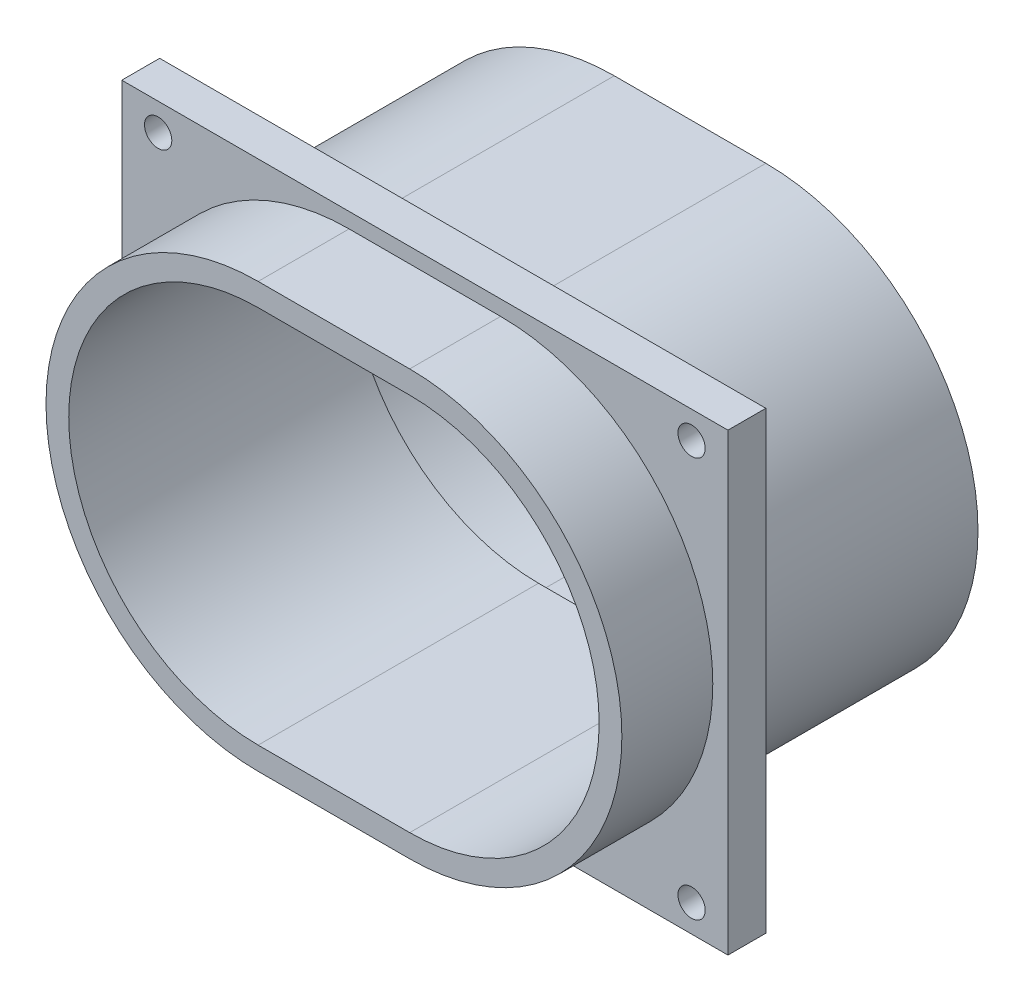
ISO-10303-21;
HEADER;
FILE_DESCRIPTION(('STEP AP214'),'2;1');
FILE_NAME('part.step','',(''),(''),'','','');
FILE_SCHEMA(('AUTOMOTIVE_DESIGN { 1 0 10303 214 1 1 1 1 }'));
ENDSEC;
DATA;
#1=APPLICATION_CONTEXT('core data for automotive mechanical design processes');
#2=APPLICATION_PROTOCOL_DEFINITION('international standard','automotive_design',2000,#1);
#3=PRODUCT_CONTEXT('',#1,'mechanical');
#4=PRODUCT('Part','Part','',(#3));
#5=PRODUCT_RELATED_PRODUCT_CATEGORY('part','',(#4));
#6=PRODUCT_DEFINITION_FORMATION('','',#4);
#7=PRODUCT_DEFINITION_CONTEXT('part definition',#1,'design');
#8=PRODUCT_DEFINITION('design','',#6,#7);
#9=PRODUCT_DEFINITION_SHAPE('','',#8);
#10=(LENGTH_UNIT() NAMED_UNIT(*) SI_UNIT(.MILLI.,.METRE.));
#11=(NAMED_UNIT(*) PLANE_ANGLE_UNIT() SI_UNIT($,.RADIAN.));
#12=(NAMED_UNIT(*) SI_UNIT($,.STERADIAN.) SOLID_ANGLE_UNIT());
#13=UNCERTAINTY_MEASURE_WITH_UNIT(LENGTH_MEASURE(1.E-05),#10,'distance_accuracy_value','');
#14=(GEOMETRIC_REPRESENTATION_CONTEXT(3) GLOBAL_UNCERTAINTY_ASSIGNED_CONTEXT((#13)) GLOBAL_UNIT_ASSIGNED_CONTEXT((#10,
#11,#12)) REPRESENTATION_CONTEXT('',''));
#15=CARTESIAN_POINT('',(0.,0.,0.));
#16=DIRECTION('',(0.,0.,1.));
#17=DIRECTION('',(1.,0.,0.));
#18=AXIS2_PLACEMENT_3D('',#15,#16,#17);
#19=CARTESIAN_POINT('',(-10.,0.,0.));
#20=DIRECTION('',(0.,0.,1.));
#21=DIRECTION('',(1.,0.,0.));
#22=AXIS2_PLACEMENT_3D('',#19,#20,#21);
#23=CYLINDRICAL_SURFACE('',#22,25.);
#24=CARTESIAN_POINT('',(-10.,0.,-25.));
#25=DIRECTION('',(0.,0.,-1.));
#26=DIRECTION('',(-1.,0.,0.));
#27=AXIS2_PLACEMENT_3D('',#24,#25,#26);
#28=CIRCLE('',#27,25.);
#29=CARTESIAN_POINT('',(-10.0000000000001,25.,-25.));
#30=VERTEX_POINT('',#29);
#31=CARTESIAN_POINT('',(-10.,-25.,-25.));
#32=VERTEX_POINT('',#31);
#33=EDGE_CURVE('E47',#30,#32,#28,.F.);
#34=ORIENTED_EDGE('',*,*,#33,.F.);
#35=DIRECTION('',(0.,0.,1.));
#36=VECTOR('',#35,1.);
#37=CARTESIAN_POINT('',(-10.,25.,0.));
#38=LINE('',#37,#36);
#39=CARTESIAN_POINT('',(-10.,25.,12.));
#40=VERTEX_POINT('',#39);
#41=EDGE_CURVE('E298',#30,#40,#38,.T.);
#42=ORIENTED_EDGE('',*,*,#41,.T.);
#43=CARTESIAN_POINT('',(-10.,0.,12.));
#44=DIRECTION('',(0.,0.,1.));
#45=DIRECTION('',(1.,0.,0.));
#46=AXIS2_PLACEMENT_3D('',#43,#44,#45);
#47=CIRCLE('',#46,25.);
#48=CARTESIAN_POINT('',(-10.,-25.,12.));
#49=VERTEX_POINT('',#48);
#50=EDGE_CURVE('E285',#40,#49,#47,.T.);
#51=ORIENTED_EDGE('',*,*,#50,.T.);
#52=DIRECTION('',(0.,0.,1.));
#53=VECTOR('',#52,1.);
#54=CARTESIAN_POINT('',(-10.,-25.,0.));
#55=LINE('',#54,#53);
#56=EDGE_CURVE('E297',#32,#49,#55,.T.);
#57=ORIENTED_EDGE('',*,*,#56,.F.);
#58=EDGE_LOOP('',(#34,#42,#51,#57));
#59=FACE_BOUND('',#58,.T.);
#60=ADVANCED_FACE('F33',(#59),#23,.F.);
#61=CARTESIAN_POINT('',(10.,25.,0.));
#62=DIRECTION('',(0.,1.,0.));
#63=DIRECTION('',(0.,0.,1.));
#64=AXIS2_PLACEMENT_3D('',#61,#62,#63);
#65=PLANE('',#64);
#66=DIRECTION('',(-1.,0.,0.));
#67=VECTOR('',#66,1.);
#68=CARTESIAN_POINT('',(10.,25.,-25.));
#69=LINE('',#68,#67);
#70=CARTESIAN_POINT('',(10.,25.,-25.));
#71=VERTEX_POINT('',#70);
#72=EDGE_CURVE('E209',#71,#30,#69,.T.);
#73=ORIENTED_EDGE('',*,*,#72,.F.);
#74=DIRECTION('',(0.,0.,1.));
#75=VECTOR('',#74,1.);
#76=CARTESIAN_POINT('',(10.,25.,0.));
#77=LINE('',#76,#75);
#78=CARTESIAN_POINT('',(10.,25.,12.));
#79=VERTEX_POINT('',#78);
#80=EDGE_CURVE('E301',#71,#79,#77,.T.);
#81=ORIENTED_EDGE('',*,*,#80,.T.);
#82=DIRECTION('',(-1.,0.,0.));
#83=VECTOR('',#82,1.);
#84=CARTESIAN_POINT('',(10.,25.,12.));
#85=LINE('',#84,#83);
#86=EDGE_CURVE('E294',#79,#40,#85,.T.);
#87=ORIENTED_EDGE('',*,*,#86,.T.);
#88=ORIENTED_EDGE('',*,*,#41,.F.);
#89=EDGE_LOOP('',(#73,#81,#87,#88));
#90=FACE_BOUND('',#89,.T.);
#91=ADVANCED_FACE('F365',(#90),#65,.F.);
#92=CARTESIAN_POINT('',(10.,0.,0.));
#93=DIRECTION('',(0.,0.,1.));
#94=DIRECTION('',(1.,0.,0.));
#95=AXIS2_PLACEMENT_3D('',#92,#93,#94);
#96=CYLINDRICAL_SURFACE('',#95,25.);
#97=CARTESIAN_POINT('',(10.,0.,-25.));
#98=DIRECTION('',(0.,0.,-1.));
#99=DIRECTION('',(-1.,0.,0.));
#100=AXIS2_PLACEMENT_3D('',#97,#98,#99);
#101=CIRCLE('',#100,25.);
#102=CARTESIAN_POINT('',(10.0000000000001,-25.,-25.));
#103=VERTEX_POINT('',#102);
#104=EDGE_CURVE('E204',#103,#71,#101,.F.);
#105=ORIENTED_EDGE('',*,*,#104,.F.);
#106=DIRECTION('',(0.,0.,1.));
#107=VECTOR('',#106,1.);
#108=CARTESIAN_POINT('',(9.99999999999999,-25.,0.));
#109=LINE('',#108,#107);
#110=CARTESIAN_POINT('',(9.99999999999999,-25.,12.));
#111=VERTEX_POINT('',#110);
#112=EDGE_CURVE('E303',#103,#111,#109,.T.);
#113=ORIENTED_EDGE('',*,*,#112,.T.);
#114=CARTESIAN_POINT('',(10.,0.,12.));
#115=DIRECTION('',(0.,0.,1.));
#116=DIRECTION('',(1.,0.,0.));
#117=AXIS2_PLACEMENT_3D('',#114,#115,#116);
#118=CIRCLE('',#117,25.);
#119=EDGE_CURVE('E291',#111,#79,#118,.T.);
#120=ORIENTED_EDGE('',*,*,#119,.T.);
#121=ORIENTED_EDGE('',*,*,#80,.F.);
#122=EDGE_LOOP('',(#105,#113,#120,#121));
#123=FACE_BOUND('',#122,.T.);
#124=ADVANCED_FACE('F371',(#123),#96,.F.);
#125=CARTESIAN_POINT('',(10.,-25.,0.));
#126=DIRECTION('',(0.,-1.,0.));
#127=DIRECTION('',(0.,0.,-1.));
#128=AXIS2_PLACEMENT_3D('',#125,#126,#127);
#129=PLANE('',#128);
#130=DIRECTION('',(1.,0.,0.));
#131=VECTOR('',#130,1.);
#132=CARTESIAN_POINT('',(10.,-25.,-25.));
#133=LINE('',#132,#131);
#134=EDGE_CURVE('E11',#32,#103,#133,.T.);
#135=ORIENTED_EDGE('',*,*,#134,.F.);
#136=ORIENTED_EDGE('',*,*,#56,.T.);
#137=DIRECTION('',(1.,0.,0.));
#138=VECTOR('',#137,1.);
#139=CARTESIAN_POINT('',(10.,-25.,12.));
#140=LINE('',#139,#138);
#141=EDGE_CURVE('E288',#49,#111,#140,.T.);
#142=ORIENTED_EDGE('',*,*,#141,.T.);
#143=ORIENTED_EDGE('',*,*,#112,.F.);
#144=EDGE_LOOP('',(#135,#136,#142,#143));
#145=FACE_BOUND('',#144,.T.);
#146=ADVANCED_FACE('F376',(#145),#129,.F.);
#147=CARTESIAN_POINT('',(0.,0.,-5.));
#148=DIRECTION('',(0.,0.,-1.));
#149=DIRECTION('',(-1.,0.,0.));
#150=AXIS2_PLACEMENT_3D('',#147,#148,#149);
#151=PLANE('',#150);
#152=CARTESIAN_POINT('',(35.2,-26.4,-5.));
#153=DIRECTION('',(0.,0.,-1.));
#154=DIRECTION('',(-1.,0.,0.));
#155=AXIS2_PLACEMENT_3D('',#152,#153,#154);
#156=CIRCLE('',#155,1.8);
#157=CARTESIAN_POINT('',(33.4,-26.4,-5.));
#158=VERTEX_POINT('',#157);
#159=EDGE_CURVE('E212',#158,#158,#156,.T.);
#160=ORIENTED_EDGE('',*,*,#159,.F.);
#161=EDGE_LOOP('',(#160));
#162=FACE_BOUND('',#161,.T.);
#163=CARTESIAN_POINT('',(-35.2,-26.4,-5.));
#164=DIRECTION('',(0.,0.,-1.));
#165=DIRECTION('',(-1.,0.,0.));
#166=AXIS2_PLACEMENT_3D('',#163,#164,#165);
#167=CIRCLE('',#166,1.8);
#168=CARTESIAN_POINT('',(-37.,-26.4,-5.));
#169=VERTEX_POINT('',#168);
#170=EDGE_CURVE('E217',#169,#169,#167,.T.);
#171=ORIENTED_EDGE('',*,*,#170,.F.);
#172=EDGE_LOOP('',(#171));
#173=FACE_BOUND('',#172,.T.);
#174=CARTESIAN_POINT('',(-35.2,26.4,-5.));
#175=DIRECTION('',(0.,0.,-1.));
#176=DIRECTION('',(-1.,0.,0.));
#177=AXIS2_PLACEMENT_3D('',#174,#175,#176);
#178=CIRCLE('',#177,1.8);
#179=CARTESIAN_POINT('',(-37.,26.4,-5.));
#180=VERTEX_POINT('',#179);
#181=EDGE_CURVE('E213',#180,#180,#178,.T.);
#182=ORIENTED_EDGE('',*,*,#181,.F.);
#183=EDGE_LOOP('',(#182));
#184=FACE_BOUND('',#183,.T.);
#185=CARTESIAN_POINT('',(35.2,26.4,-5.));
#186=DIRECTION('',(0.,0.,-1.));
#187=DIRECTION('',(-1.,0.,0.));
#188=AXIS2_PLACEMENT_3D('',#185,#186,#187);
#189=CIRCLE('',#188,1.8);
#190=CARTESIAN_POINT('',(33.4,26.4,-5.));
#191=VERTEX_POINT('',#190);
#192=EDGE_CURVE('E216',#191,#191,#189,.T.);
#193=ORIENTED_EDGE('',*,*,#192,.F.);
#194=EDGE_LOOP('',(#193));
#195=FACE_BOUND('',#194,.T.);
#196=DIRECTION('',(0.,-1.,0.));
#197=VECTOR('',#196,1.);
#198=CARTESIAN_POINT('',(40.,-30.,-5.));
#199=LINE('',#198,#197);
#200=CARTESIAN_POINT('',(40.,30.,-5.));
#201=VERTEX_POINT('',#200);
#202=CARTESIAN_POINT('',(40.,-30.,-5.));
#203=VERTEX_POINT('',#202);
#204=EDGE_CURVE('E256',#201,#203,#199,.T.);
#205=ORIENTED_EDGE('',*,*,#204,.T.);
#206=DIRECTION('',(-1.,0.,0.));
#207=VECTOR('',#206,1.);
#208=CARTESIAN_POINT('',(-40.,-30.,-5.));
#209=LINE('',#208,#207);
#210=CARTESIAN_POINT('',(-40.,-30.,-5.));
#211=VERTEX_POINT('',#210);
#212=EDGE_CURVE('E259',#203,#211,#209,.T.);
#213=ORIENTED_EDGE('',*,*,#212,.T.);
#214=DIRECTION('',(0.,1.,0.));
#215=VECTOR('',#214,1.);
#216=CARTESIAN_POINT('',(-40.,-30.,-5.));
#217=LINE('',#216,#215);
#218=CARTESIAN_POINT('',(-40.,30.,-5.));
#219=VERTEX_POINT('',#218);
#220=EDGE_CURVE('E262',#211,#219,#217,.T.);
#221=ORIENTED_EDGE('',*,*,#220,.T.);
#222=DIRECTION('',(1.,0.,0.));
#223=VECTOR('',#222,1.);
#224=CARTESIAN_POINT('',(-40.,30.,-5.));
#225=LINE('',#224,#223);
#226=EDGE_CURVE('E264',#219,#201,#225,.T.);
#227=ORIENTED_EDGE('',*,*,#226,.T.);
#228=EDGE_LOOP('',(#205,#213,#221,#227));
#229=FACE_BOUND('',#228,.T.);
#230=DIRECTION('',(-1.,0.,0.));
#231=VECTOR('',#230,1.);
#232=CARTESIAN_POINT('',(-10.,-28.,-5.));
#233=LINE('',#232,#231);
#234=CARTESIAN_POINT('',(10.,-28.,-5.));
#235=VERTEX_POINT('',#234);
#236=CARTESIAN_POINT('',(-10.,-28.,-5.));
#237=VERTEX_POINT('',#236);
#238=EDGE_CURVE('E239',#235,#237,#233,.T.);
#239=ORIENTED_EDGE('',*,*,#238,.F.);
#240=CARTESIAN_POINT('',(10.,0.,-5.));
#241=DIRECTION('',(0.,0.,-1.));
#242=DIRECTION('',(-1.,0.,0.));
#243=AXIS2_PLACEMENT_3D('',#240,#241,#242);
#244=CIRCLE('',#243,28.);
#245=CARTESIAN_POINT('',(10.,28.,-5.));
#246=VERTEX_POINT('',#245);
#247=EDGE_CURVE('E236',#246,#235,#244,.T.);
#248=ORIENTED_EDGE('',*,*,#247,.F.);
#249=DIRECTION('',(1.,0.,0.));
#250=VECTOR('',#249,1.);
#251=CARTESIAN_POINT('',(-10.,28.,-5.));
#252=LINE('',#251,#250);
#253=CARTESIAN_POINT('',(-10.,28.,-5.));
#254=VERTEX_POINT('',#253);
#255=EDGE_CURVE('E229',#254,#246,#252,.T.);
#256=ORIENTED_EDGE('',*,*,#255,.F.);
#257=CARTESIAN_POINT('',(-10.,0.,-5.));
#258=DIRECTION('',(0.,0.,-1.));
#259=DIRECTION('',(-1.,0.,0.));
#260=AXIS2_PLACEMENT_3D('',#257,#258,#259);
#261=CIRCLE('',#260,28.);
#262=EDGE_CURVE('E242',#237,#254,#261,.T.);
#263=ORIENTED_EDGE('',*,*,#262,.F.);
#264=EDGE_LOOP('',(#239,#248,#256,#263));
#265=FACE_BOUND('',#264,.T.);
#266=ADVANCED_FACE('F395',(#162,#173,#184,#195,#229,#265),#151,.T.);
#267=CARTESIAN_POINT('',(-10.,0.,12.));
#268=DIRECTION('',(0.,0.,-1.));
#269=DIRECTION('',(-1.,0.,0.));
#270=AXIS2_PLACEMENT_3D('',#267,#268,#269);
#271=CYLINDRICAL_SURFACE('',#270,28.);
#272=CARTESIAN_POINT('',(-10.,0.,0.));
#273=DIRECTION('',(0.,0.,1.));
#274=DIRECTION('',(1.,0.,0.));
#275=AXIS2_PLACEMENT_3D('',#272,#273,#274);
#276=CIRCLE('',#275,28.);
#277=CARTESIAN_POINT('',(-10.,28.,0.));
#278=VERTEX_POINT('',#277);
#279=CARTESIAN_POINT('',(-10.,-28.,0.));
#280=VERTEX_POINT('',#279);
#281=EDGE_CURVE('E300',#278,#280,#276,.T.);
#282=ORIENTED_EDGE('',*,*,#281,.T.);
#283=DIRECTION('',(0.,0.,-1.));
#284=VECTOR('',#283,1.);
#285=CARTESIAN_POINT('',(-10.,-28.,12.));
#286=LINE('',#285,#284);
#287=CARTESIAN_POINT('',(-10.,-28.,12.));
#288=VERTEX_POINT('',#287);
#289=EDGE_CURVE('E41',#288,#280,#286,.T.);
#290=ORIENTED_EDGE('',*,*,#289,.F.);
#291=CARTESIAN_POINT('',(-10.,0.,12.));
#292=DIRECTION('',(0.,0.,1.));
#293=DIRECTION('',(1.,0.,0.));
#294=AXIS2_PLACEMENT_3D('',#291,#292,#293);
#295=CIRCLE('',#294,28.);
#296=CARTESIAN_POINT('',(-10.,28.,12.));
#297=VERTEX_POINT('',#296);
#298=EDGE_CURVE('E306',#297,#288,#295,.T.);
#299=ORIENTED_EDGE('',*,*,#298,.F.);
#300=DIRECTION('',(0.,0.,-1.));
#301=VECTOR('',#300,1.);
#302=CARTESIAN_POINT('',(-10.,28.,12.));
#303=LINE('',#302,#301);
#304=EDGE_CURVE('E316',#297,#278,#303,.T.);
#305=ORIENTED_EDGE('',*,*,#304,.T.);
#306=EDGE_LOOP('',(#282,#290,#299,#305));
#307=FACE_BOUND('',#306,.T.);
#308=ADVANCED_FACE('F35',(#307),#271,.T.);
#309=CARTESIAN_POINT('',(10.,-28.,12.));
#310=DIRECTION('',(0.,1.,0.));
#311=DIRECTION('',(-1.,0.,0.));
#312=AXIS2_PLACEMENT_3D('',#309,#310,#311);
#313=PLANE('',#312);
#314=DIRECTION('',(1.,0.,0.));
#315=VECTOR('',#314,1.);
#316=CARTESIAN_POINT('',(10.,-28.,0.));
#317=LINE('',#316,#315);
#318=CARTESIAN_POINT('',(9.99999999999999,-28.,0.));
#319=VERTEX_POINT('',#318);
#320=EDGE_CURVE('E319',#280,#319,#317,.T.);
#321=ORIENTED_EDGE('',*,*,#320,.T.);
#322=DIRECTION('',(0.,0.,-1.));
#323=VECTOR('',#322,1.);
#324=CARTESIAN_POINT('',(9.99999999999999,-28.,12.));
#325=LINE('',#324,#323);
#326=CARTESIAN_POINT('',(9.99999999999999,-28.,12.));
#327=VERTEX_POINT('',#326);
#328=EDGE_CURVE('E332',#327,#319,#325,.T.);
#329=ORIENTED_EDGE('',*,*,#328,.F.);
#330=DIRECTION('',(1.,0.,0.));
#331=VECTOR('',#330,1.);
#332=CARTESIAN_POINT('',(10.,-28.,12.));
#333=LINE('',#332,#331);
#334=EDGE_CURVE('E309',#288,#327,#333,.T.);
#335=ORIENTED_EDGE('',*,*,#334,.F.);
#336=ORIENTED_EDGE('',*,*,#289,.T.);
#337=EDGE_LOOP('',(#321,#329,#335,#336));
#338=FACE_BOUND('',#337,.T.);
#339=ADVANCED_FACE('F388',(#338),#313,.F.);
#340=CARTESIAN_POINT('',(10.,0.,12.));
#341=DIRECTION('',(0.,0.,-1.));
#342=DIRECTION('',(-1.,0.,0.));
#343=AXIS2_PLACEMENT_3D('',#340,#341,#342);
#344=CYLINDRICAL_SURFACE('',#343,28.);
#345=CARTESIAN_POINT('',(10.,0.,0.));
#346=DIRECTION('',(0.,0.,1.));
#347=DIRECTION('',(1.,0.,0.));
#348=AXIS2_PLACEMENT_3D('',#345,#346,#347);
#349=CIRCLE('',#348,28.);
#350=CARTESIAN_POINT('',(10.,28.,0.));
#351=VERTEX_POINT('',#350);
#352=EDGE_CURVE('E322',#319,#351,#349,.T.);
#353=ORIENTED_EDGE('',*,*,#352,.T.);
#354=DIRECTION('',(0.,0.,-1.));
#355=VECTOR('',#354,1.);
#356=CARTESIAN_POINT('',(10.,28.,12.));
#357=LINE('',#356,#355);
#358=CARTESIAN_POINT('',(10.,28.,12.));
#359=VERTEX_POINT('',#358);
#360=EDGE_CURVE('E329',#359,#351,#357,.T.);
#361=ORIENTED_EDGE('',*,*,#360,.F.);
#362=CARTESIAN_POINT('',(10.,0.,12.));
#363=DIRECTION('',(0.,0.,1.));
#364=DIRECTION('',(1.,0.,0.));
#365=AXIS2_PLACEMENT_3D('',#362,#363,#364);
#366=CIRCLE('',#365,28.);
#367=EDGE_CURVE('E312',#327,#359,#366,.T.);
#368=ORIENTED_EDGE('',*,*,#367,.F.);
#369=ORIENTED_EDGE('',*,*,#328,.T.);
#370=EDGE_LOOP('',(#353,#361,#368,#369));
#371=FACE_BOUND('',#370,.T.);
#372=ADVANCED_FACE('F385',(#371),#344,.T.);
#373=CARTESIAN_POINT('',(10.,28.,12.));
#374=DIRECTION('',(0.,-1.,0.));
#375=DIRECTION('',(0.,0.,-1.));
#376=AXIS2_PLACEMENT_3D('',#373,#374,#375);
#377=PLANE('',#376);
#378=DIRECTION('',(-1.,0.,0.));
#379=VECTOR('',#378,1.);
#380=CARTESIAN_POINT('',(10.,28.,0.));
#381=LINE('',#380,#379);
#382=EDGE_CURVE('E310',#351,#278,#381,.T.);
#383=ORIENTED_EDGE('',*,*,#382,.T.);
#384=ORIENTED_EDGE('',*,*,#304,.F.);
#385=DIRECTION('',(-1.,0.,0.));
#386=VECTOR('',#385,1.);
#387=CARTESIAN_POINT('',(10.,28.,12.));
#388=LINE('',#387,#386);
#389=EDGE_CURVE('E314',#359,#297,#388,.T.);
#390=ORIENTED_EDGE('',*,*,#389,.F.);
#391=ORIENTED_EDGE('',*,*,#360,.T.);
#392=EDGE_LOOP('',(#383,#384,#390,#391));
#393=FACE_BOUND('',#392,.T.);
#394=ADVANCED_FACE('F381',(#393),#377,.F.);
#395=CARTESIAN_POINT('',(-10.,0.,12.));
#396=DIRECTION('',(0.,0.,1.));
#397=DIRECTION('',(1.,0.,0.));
#398=AXIS2_PLACEMENT_3D('',#395,#396,#397);
#399=PLANE('',#398);
#400=ORIENTED_EDGE('',*,*,#50,.F.);
#401=ORIENTED_EDGE('',*,*,#86,.F.);
#402=ORIENTED_EDGE('',*,*,#119,.F.);
#403=ORIENTED_EDGE('',*,*,#141,.F.);
#404=EDGE_LOOP('',(#400,#401,#402,#403));
#405=FACE_BOUND('',#404,.T.);
#406=ORIENTED_EDGE('',*,*,#298,.T.);
#407=ORIENTED_EDGE('',*,*,#334,.T.);
#408=ORIENTED_EDGE('',*,*,#367,.T.);
#409=ORIENTED_EDGE('',*,*,#389,.T.);
#410=EDGE_LOOP('',(#406,#407,#408,#409));
#411=FACE_BOUND('',#410,.T.);
#412=ADVANCED_FACE('F378',(#405,#411),#399,.T.);
#413=CARTESIAN_POINT('',(0.,0.,0.));
#414=DIRECTION('',(0.,0.,-1.));
#415=DIRECTION('',(-1.,0.,0.));
#416=AXIS2_PLACEMENT_3D('',#413,#414,#415);
#417=PLANE('',#416);
#418=CARTESIAN_POINT('',(35.2,-26.4,0.));
#419=DIRECTION('',(0.,0.,-1.));
#420=DIRECTION('',(-1.,0.,0.));
#421=AXIS2_PLACEMENT_3D('',#418,#419,#420);
#422=CIRCLE('',#421,1.8);
#423=CARTESIAN_POINT('',(33.4,-26.4,0.));
#424=VERTEX_POINT('',#423);
#425=EDGE_CURVE('E240',#424,#424,#422,.T.);
#426=ORIENTED_EDGE('',*,*,#425,.T.);
#427=EDGE_LOOP('',(#426));
#428=FACE_BOUND('',#427,.T.);
#429=CARTESIAN_POINT('',(-35.2,-26.4,0.));
#430=DIRECTION('',(0.,0.,-1.));
#431=DIRECTION('',(-1.,0.,0.));
#432=AXIS2_PLACEMENT_3D('',#429,#430,#431);
#433=CIRCLE('',#432,1.8);
#434=CARTESIAN_POINT('',(-37.,-26.4,0.));
#435=VERTEX_POINT('',#434);
#436=EDGE_CURVE('E342',#435,#435,#433,.T.);
#437=ORIENTED_EDGE('',*,*,#436,.T.);
#438=EDGE_LOOP('',(#437));
#439=FACE_BOUND('',#438,.T.);
#440=CARTESIAN_POINT('',(-35.2,26.4,0.));
#441=DIRECTION('',(0.,0.,-1.));
#442=DIRECTION('',(-1.,0.,0.));
#443=AXIS2_PLACEMENT_3D('',#440,#441,#442);
#444=CIRCLE('',#443,1.8);
#445=CARTESIAN_POINT('',(-37.,26.4,0.));
#446=VERTEX_POINT('',#445);
#447=EDGE_CURVE('E339',#446,#446,#444,.T.);
#448=ORIENTED_EDGE('',*,*,#447,.T.);
#449=EDGE_LOOP('',(#448));
#450=FACE_BOUND('',#449,.T.);
#451=CARTESIAN_POINT('',(35.2,26.4,0.));
#452=DIRECTION('',(0.,0.,-1.));
#453=DIRECTION('',(-1.,0.,0.));
#454=AXIS2_PLACEMENT_3D('',#451,#452,#453);
#455=CIRCLE('',#454,1.8);
#456=CARTESIAN_POINT('',(33.4,26.4,0.));
#457=VERTEX_POINT('',#456);
#458=EDGE_CURVE('E224',#457,#457,#455,.T.);
#459=ORIENTED_EDGE('',*,*,#458,.T.);
#460=EDGE_LOOP('',(#459));
#461=FACE_BOUND('',#460,.T.);
#462=ORIENTED_EDGE('',*,*,#281,.F.);
#463=ORIENTED_EDGE('',*,*,#382,.F.);
#464=ORIENTED_EDGE('',*,*,#352,.F.);
#465=ORIENTED_EDGE('',*,*,#320,.F.);
#466=EDGE_LOOP('',(#462,#463,#464,#465));
#467=FACE_BOUND('',#466,.T.);
#468=DIRECTION('',(0.,-1.,0.));
#469=VECTOR('',#468,1.);
#470=CARTESIAN_POINT('',(40.,-30.,0.));
#471=LINE('',#470,#469);
#472=CARTESIAN_POINT('',(40.,30.,0.));
#473=VERTEX_POINT('',#472);
#474=CARTESIAN_POINT('',(40.,-30.,0.));
#475=VERTEX_POINT('',#474);
#476=EDGE_CURVE('E255',#473,#475,#471,.T.);
#477=ORIENTED_EDGE('',*,*,#476,.F.);
#478=DIRECTION('',(1.,0.,0.));
#479=VECTOR('',#478,1.);
#480=CARTESIAN_POINT('',(-40.,30.,0.));
#481=LINE('',#480,#479);
#482=CARTESIAN_POINT('',(-40.,30.,0.));
#483=VERTEX_POINT('',#482);
#484=EDGE_CURVE('E260',#483,#473,#481,.T.);
#485=ORIENTED_EDGE('',*,*,#484,.F.);
#486=DIRECTION('',(0.,1.,0.));
#487=VECTOR('',#486,1.);
#488=CARTESIAN_POINT('',(-40.,-30.,0.));
#489=LINE('',#488,#487);
#490=CARTESIAN_POINT('',(-40.,-30.,0.));
#491=VERTEX_POINT('',#490);
#492=EDGE_CURVE('E271',#491,#483,#489,.T.);
#493=ORIENTED_EDGE('',*,*,#492,.F.);
#494=DIRECTION('',(-1.,0.,0.));
#495=VECTOR('',#494,1.);
#496=CARTESIAN_POINT('',(-40.,-30.,0.));
#497=LINE('',#496,#495);
#498=EDGE_CURVE('E269',#475,#491,#497,.T.);
#499=ORIENTED_EDGE('',*,*,#498,.F.);
#500=EDGE_LOOP('',(#477,#485,#493,#499));
#501=FACE_BOUND('',#500,.T.);
#502=ADVANCED_FACE('F347',(#428,#439,#450,#461,#467,#501),#417,.F.);
#503=CARTESIAN_POINT('',(40.,-30.,-5.));
#504=DIRECTION('',(-1.,0.,0.));
#505=DIRECTION('',(0.,0.,1.));
#506=AXIS2_PLACEMENT_3D('',#503,#504,#505);
#507=PLANE('',#506);
#508=ORIENTED_EDGE('',*,*,#476,.T.);
#509=DIRECTION('',(0.,0.,1.));
#510=VECTOR('',#509,1.);
#511=CARTESIAN_POINT('',(40.,-30.,-5.));
#512=LINE('',#511,#510);
#513=EDGE_CURVE('E282',#203,#475,#512,.T.);
#514=ORIENTED_EDGE('',*,*,#513,.F.);
#515=ORIENTED_EDGE('',*,*,#204,.F.);
#516=DIRECTION('',(0.,0.,1.));
#517=VECTOR('',#516,1.);
#518=CARTESIAN_POINT('',(40.,30.,-5.));
#519=LINE('',#518,#517);
#520=EDGE_CURVE('E266',#201,#473,#519,.T.);
#521=ORIENTED_EDGE('',*,*,#520,.T.);
#522=EDGE_LOOP('',(#508,#514,#515,#521));
#523=FACE_BOUND('',#522,.T.);
#524=ADVANCED_FACE('F408',(#523),#507,.F.);
#525=CARTESIAN_POINT('',(-40.,-30.,-5.));
#526=DIRECTION('',(0.,1.,0.));
#527=DIRECTION('',(-1.,0.,0.));
#528=AXIS2_PLACEMENT_3D('',#525,#526,#527);
#529=PLANE('',#528);
#530=ORIENTED_EDGE('',*,*,#498,.T.);
#531=DIRECTION('',(0.,0.,1.));
#532=VECTOR('',#531,1.);
#533=CARTESIAN_POINT('',(-40.,-30.,-5.));
#534=LINE('',#533,#532);
#535=EDGE_CURVE('E279',#211,#491,#534,.T.);
#536=ORIENTED_EDGE('',*,*,#535,.F.);
#537=ORIENTED_EDGE('',*,*,#212,.F.);
#538=ORIENTED_EDGE('',*,*,#513,.T.);
#539=EDGE_LOOP('',(#530,#536,#537,#538));
#540=FACE_BOUND('',#539,.T.);
#541=ADVANCED_FACE('F426',(#540),#529,.F.);
#542=CARTESIAN_POINT('',(-40.,-30.,-5.));
#543=DIRECTION('',(1.,0.,0.));
#544=DIRECTION('',(0.,0.,-1.));
#545=AXIS2_PLACEMENT_3D('',#542,#543,#544);
#546=PLANE('',#545);
#547=ORIENTED_EDGE('',*,*,#492,.T.);
#548=DIRECTION('',(0.,0.,1.));
#549=VECTOR('',#548,1.);
#550=CARTESIAN_POINT('',(-40.,30.,-5.));
#551=LINE('',#550,#549);
#552=EDGE_CURVE('E276',#219,#483,#551,.T.);
#553=ORIENTED_EDGE('',*,*,#552,.F.);
#554=ORIENTED_EDGE('',*,*,#220,.F.);
#555=ORIENTED_EDGE('',*,*,#535,.T.);
#556=EDGE_LOOP('',(#547,#553,#554,#555));
#557=FACE_BOUND('',#556,.T.);
#558=ADVANCED_FACE('F423',(#557),#546,.F.);
#559=CARTESIAN_POINT('',(-40.,30.,-5.));
#560=DIRECTION('',(0.,-1.,0.));
#561=DIRECTION('',(1.,0.,0.));
#562=AXIS2_PLACEMENT_3D('',#559,#560,#561);
#563=PLANE('',#562);
#564=ORIENTED_EDGE('',*,*,#484,.T.);
#565=ORIENTED_EDGE('',*,*,#520,.F.);
#566=ORIENTED_EDGE('',*,*,#226,.F.);
#567=ORIENTED_EDGE('',*,*,#552,.T.);
#568=EDGE_LOOP('',(#564,#565,#566,#567));
#569=FACE_BOUND('',#568,.T.);
#570=ADVANCED_FACE('F419',(#569),#563,.F.);
#571=CARTESIAN_POINT('',(10.,0.,-35.));
#572=DIRECTION('',(0.,0.,-1.));
#573=DIRECTION('',(-1.,0.,0.));
#574=AXIS2_PLACEMENT_3D('',#571,#572,#573);
#575=PLANE('',#574);
#576=CARTESIAN_POINT('',(10.,0.,-35.));
#577=DIRECTION('',(0.,0.,-1.));
#578=DIRECTION('',(-1.,0.,0.));
#579=AXIS2_PLACEMENT_3D('',#576,#577,#578);
#580=CIRCLE('',#579,26.);
#581=CARTESIAN_POINT('',(10.,26.,-35.));
#582=VERTEX_POINT('',#581);
#583=CARTESIAN_POINT('',(10.,-26.,-35.));
#584=VERTEX_POINT('',#583);
#585=EDGE_CURVE('E55',#582,#584,#580,.T.);
#586=ORIENTED_EDGE('',*,*,#585,.F.);
#587=DIRECTION('',(1.,0.,0.));
#588=VECTOR('',#587,1.);
#589=CARTESIAN_POINT('',(-9.99999999999999,26.,-35.));
#590=LINE('',#589,#588);
#591=CARTESIAN_POINT('',(-9.99999999999999,26.,-35.));
#592=VERTEX_POINT('',#591);
#593=EDGE_CURVE('E189',#592,#582,#590,.T.);
#594=ORIENTED_EDGE('',*,*,#593,.F.);
#595=CARTESIAN_POINT('',(-10.,0.,-35.));
#596=DIRECTION('',(0.,0.,-1.));
#597=DIRECTION('',(-1.,0.,0.));
#598=AXIS2_PLACEMENT_3D('',#595,#596,#597);
#599=CIRCLE('',#598,26.);
#600=CARTESIAN_POINT('',(-10.,-26.,-35.));
#601=VERTEX_POINT('',#600);
#602=EDGE_CURVE('E192',#601,#592,#599,.T.);
#603=ORIENTED_EDGE('',*,*,#602,.F.);
#604=DIRECTION('',(-1.,0.,0.));
#605=VECTOR('',#604,1.);
#606=CARTESIAN_POINT('',(-9.99999999999999,-26.,-35.));
#607=LINE('',#606,#605);
#608=EDGE_CURVE('E198',#584,#601,#607,.T.);
#609=ORIENTED_EDGE('',*,*,#608,.F.);
#610=EDGE_LOOP('',(#586,#594,#603,#609));
#611=FACE_BOUND('',#610,.T.);
#612=CARTESIAN_POINT('',(10.,0.,-35.));
#613=DIRECTION('',(0.,0.,-1.));
#614=DIRECTION('',(-1.,0.,0.));
#615=AXIS2_PLACEMENT_3D('',#612,#613,#614);
#616=CIRCLE('',#615,28.);
#617=CARTESIAN_POINT('',(10.,28.,-35.));
#618=VERTEX_POINT('',#617);
#619=CARTESIAN_POINT('',(10.,-28.,-35.));
#620=VERTEX_POINT('',#619);
#621=EDGE_CURVE('E225',#618,#620,#616,.T.);
#622=ORIENTED_EDGE('',*,*,#621,.T.);
#623=DIRECTION('',(-1.,0.,0.));
#624=VECTOR('',#623,1.);
#625=CARTESIAN_POINT('',(-10.,-28.,-35.));
#626=LINE('',#625,#624);
#627=CARTESIAN_POINT('',(-10.,-28.,-35.));
#628=VERTEX_POINT('',#627);
#629=EDGE_CURVE('E228',#620,#628,#626,.T.);
#630=ORIENTED_EDGE('',*,*,#629,.T.);
#631=CARTESIAN_POINT('',(-10.,0.,-35.));
#632=DIRECTION('',(0.,0.,-1.));
#633=DIRECTION('',(-1.,0.,0.));
#634=AXIS2_PLACEMENT_3D('',#631,#632,#633);
#635=CIRCLE('',#634,28.);
#636=CARTESIAN_POINT('',(-10.,28.,-35.));
#637=VERTEX_POINT('',#636);
#638=EDGE_CURVE('E231',#628,#637,#635,.T.);
#639=ORIENTED_EDGE('',*,*,#638,.T.);
#640=DIRECTION('',(1.,0.,0.));
#641=VECTOR('',#640,1.);
#642=CARTESIAN_POINT('',(-10.,28.,-35.));
#643=LINE('',#642,#641);
#644=EDGE_CURVE('E233',#637,#618,#643,.T.);
#645=ORIENTED_EDGE('',*,*,#644,.T.);
#646=EDGE_LOOP('',(#622,#630,#639,#645));
#647=FACE_BOUND('',#646,.T.);
#648=ADVANCED_FACE('F446',(#611,#647),#575,.T.);
#649=CARTESIAN_POINT('',(10.,0.,-35.));
#650=DIRECTION('',(0.,0.,1.));
#651=DIRECTION('',(1.,0.,0.));
#652=AXIS2_PLACEMENT_3D('',#649,#650,#651);
#653=CYLINDRICAL_SURFACE('',#652,28.);
#654=ORIENTED_EDGE('',*,*,#247,.T.);
#655=DIRECTION('',(0.,0.,1.));
#656=VECTOR('',#655,1.);
#657=CARTESIAN_POINT('',(10.,-28.,-35.));
#658=LINE('',#657,#656);
#659=EDGE_CURVE('E253',#620,#235,#658,.T.);
#660=ORIENTED_EDGE('',*,*,#659,.F.);
#661=ORIENTED_EDGE('',*,*,#621,.F.);
#662=DIRECTION('',(0.,0.,1.));
#663=VECTOR('',#662,1.);
#664=CARTESIAN_POINT('',(10.,28.,-35.));
#665=LINE('',#664,#663);
#666=EDGE_CURVE('E235',#618,#246,#665,.T.);
#667=ORIENTED_EDGE('',*,*,#666,.T.);
#668=EDGE_LOOP('',(#654,#660,#661,#667));
#669=FACE_BOUND('',#668,.T.);
#670=ADVANCED_FACE('F450',(#669),#653,.T.);
#671=CARTESIAN_POINT('',(-10.,-28.,-35.));
#672=DIRECTION('',(0.,1.,0.));
#673=DIRECTION('',(0.,0.,1.));
#674=AXIS2_PLACEMENT_3D('',#671,#672,#673);
#675=PLANE('',#674);
#676=ORIENTED_EDGE('',*,*,#238,.T.);
#677=DIRECTION('',(0.,0.,1.));
#678=VECTOR('',#677,1.);
#679=CARTESIAN_POINT('',(-10.,-28.,-35.));
#680=LINE('',#679,#678);
#681=EDGE_CURVE('E250',#628,#237,#680,.T.);
#682=ORIENTED_EDGE('',*,*,#681,.F.);
#683=ORIENTED_EDGE('',*,*,#629,.F.);
#684=ORIENTED_EDGE('',*,*,#659,.T.);
#685=EDGE_LOOP('',(#676,#682,#683,#684));
#686=FACE_BOUND('',#685,.T.);
#687=ADVANCED_FACE('F438',(#686),#675,.F.);
#688=CARTESIAN_POINT('',(-10.,0.,-35.));
#689=DIRECTION('',(0.,0.,1.));
#690=DIRECTION('',(1.,0.,0.));
#691=AXIS2_PLACEMENT_3D('',#688,#689,#690);
#692=CYLINDRICAL_SURFACE('',#691,28.);
#693=ORIENTED_EDGE('',*,*,#262,.T.);
#694=DIRECTION('',(0.,0.,1.));
#695=VECTOR('',#694,1.);
#696=CARTESIAN_POINT('',(-10.,28.,-35.));
#697=LINE('',#696,#695);
#698=EDGE_CURVE('E248',#637,#254,#697,.T.);
#699=ORIENTED_EDGE('',*,*,#698,.F.);
#700=ORIENTED_EDGE('',*,*,#638,.F.);
#701=ORIENTED_EDGE('',*,*,#681,.T.);
#702=EDGE_LOOP('',(#693,#699,#700,#701));
#703=FACE_BOUND('',#702,.T.);
#704=ADVANCED_FACE('F442',(#703),#692,.T.);
#705=CARTESIAN_POINT('',(-10.,28.,-35.));
#706=DIRECTION('',(0.,-1.,0.));
#707=DIRECTION('',(0.,0.,-1.));
#708=AXIS2_PLACEMENT_3D('',#705,#706,#707);
#709=PLANE('',#708);
#710=ORIENTED_EDGE('',*,*,#255,.T.);
#711=ORIENTED_EDGE('',*,*,#666,.F.);
#712=ORIENTED_EDGE('',*,*,#644,.F.);
#713=ORIENTED_EDGE('',*,*,#698,.T.);
#714=EDGE_LOOP('',(#710,#711,#712,#713));
#715=FACE_BOUND('',#714,.T.);
#716=ADVANCED_FACE('F452',(#715),#709,.F.);
#717=CARTESIAN_POINT('',(35.2,26.4,25.));
#718=DIRECTION('',(0.,0.,-1.));
#719=DIRECTION('',(-1.,0.,0.));
#720=AXIS2_PLACEMENT_3D('',#717,#718,#719);
#721=CYLINDRICAL_SURFACE('',#720,1.8);
#722=ORIENTED_EDGE('',*,*,#192,.T.);
#723=EDGE_LOOP('',(#722));
#724=FACE_BOUND('',#723,.T.);
#725=ORIENTED_EDGE('',*,*,#458,.F.);
#726=EDGE_LOOP('',(#725));
#727=FACE_BOUND('',#726,.T.);
#728=ADVANCED_FACE('F454',(#724,#727),#721,.F.);
#729=CARTESIAN_POINT('',(-35.2,26.4,25.));
#730=DIRECTION('',(0.,0.,-1.));
#731=DIRECTION('',(-1.,0.,0.));
#732=AXIS2_PLACEMENT_3D('',#729,#730,#731);
#733=CYLINDRICAL_SURFACE('',#732,1.8);
#734=ORIENTED_EDGE('',*,*,#181,.T.);
#735=EDGE_LOOP('',(#734));
#736=FACE_BOUND('',#735,.T.);
#737=ORIENTED_EDGE('',*,*,#447,.F.);
#738=EDGE_LOOP('',(#737));
#739=FACE_BOUND('',#738,.T.);
#740=ADVANCED_FACE('F360',(#736,#739),#733,.F.);
#741=CARTESIAN_POINT('',(-35.2,-26.4,25.));
#742=DIRECTION('',(0.,0.,-1.));
#743=DIRECTION('',(-1.,0.,0.));
#744=AXIS2_PLACEMENT_3D('',#741,#742,#743);
#745=CYLINDRICAL_SURFACE('',#744,1.8);
#746=ORIENTED_EDGE('',*,*,#170,.T.);
#747=EDGE_LOOP('',(#746));
#748=FACE_BOUND('',#747,.T.);
#749=ORIENTED_EDGE('',*,*,#436,.F.);
#750=EDGE_LOOP('',(#749));
#751=FACE_BOUND('',#750,.T.);
#752=ADVANCED_FACE('F352',(#748,#751),#745,.F.);
#753=CARTESIAN_POINT('',(35.2,-26.4,25.));
#754=DIRECTION('',(0.,0.,-1.));
#755=DIRECTION('',(-1.,0.,0.));
#756=AXIS2_PLACEMENT_3D('',#753,#754,#755);
#757=CYLINDRICAL_SURFACE('',#756,1.8);
#758=ORIENTED_EDGE('',*,*,#159,.T.);
#759=EDGE_LOOP('',(#758));
#760=FACE_BOUND('',#759,.T.);
#761=ORIENTED_EDGE('',*,*,#425,.F.);
#762=EDGE_LOOP('',(#761));
#763=FACE_BOUND('',#762,.T.);
#764=ADVANCED_FACE('F350',(#760,#763),#757,.F.);
#765=CARTESIAN_POINT('',(10.,0.,-25.));
#766=DIRECTION('',(0.,0.,-1.));
#767=DIRECTION('',(-1.,0.,0.));
#768=AXIS2_PLACEMENT_3D('',#765,#766,#767);
#769=PLANE('',#768);
#770=CARTESIAN_POINT('',(10.,0.,-25.));
#771=DIRECTION('',(0.,0.,-1.));
#772=DIRECTION('',(-1.,0.,0.));
#773=AXIS2_PLACEMENT_3D('',#770,#771,#772);
#774=CIRCLE('',#773,26.);
#775=CARTESIAN_POINT('',(10.,26.,-25.));
#776=VERTEX_POINT('',#775);
#777=CARTESIAN_POINT('',(10.,-26.,-25.));
#778=VERTEX_POINT('',#777);
#779=EDGE_CURVE('E171',#776,#778,#774,.T.);
#780=ORIENTED_EDGE('',*,*,#779,.T.);
#781=DIRECTION('',(-1.,0.,0.));
#782=VECTOR('',#781,1.);
#783=CARTESIAN_POINT('',(-9.99999999999999,-26.,-25.));
#784=LINE('',#783,#782);
#785=CARTESIAN_POINT('',(-10.,-26.,-25.));
#786=VERTEX_POINT('',#785);
#787=EDGE_CURVE('E180',#778,#786,#784,.T.);
#788=ORIENTED_EDGE('',*,*,#787,.T.);
#789=CARTESIAN_POINT('',(-10.,0.,-25.));
#790=DIRECTION('',(0.,0.,-1.));
#791=DIRECTION('',(-1.,0.,0.));
#792=AXIS2_PLACEMENT_3D('',#789,#790,#791);
#793=CIRCLE('',#792,26.);
#794=CARTESIAN_POINT('',(-9.99999999999999,26.,-25.));
#795=VERTEX_POINT('',#794);
#796=EDGE_CURVE('E185',#786,#795,#793,.T.);
#797=ORIENTED_EDGE('',*,*,#796,.T.);
#798=DIRECTION('',(1.,0.,0.));
#799=VECTOR('',#798,1.);
#800=CARTESIAN_POINT('',(-9.99999999999999,26.,-25.));
#801=LINE('',#800,#799);
#802=EDGE_CURVE('E177',#795,#776,#801,.T.);
#803=ORIENTED_EDGE('',*,*,#802,.T.);
#804=EDGE_LOOP('',(#780,#788,#797,#803));
#805=FACE_BOUND('',#804,.T.);
#806=ORIENTED_EDGE('',*,*,#33,.T.);
#807=ORIENTED_EDGE('',*,*,#134,.T.);
#808=ORIENTED_EDGE('',*,*,#104,.T.);
#809=ORIENTED_EDGE('',*,*,#72,.T.);
#810=EDGE_LOOP('',(#806,#807,#808,#809));
#811=FACE_BOUND('',#810,.T.);
#812=ADVANCED_FACE('F187',(#805,#811),#769,.T.);
#813=CARTESIAN_POINT('',(10.,0.,-25.));
#814=DIRECTION('',(0.,0.,-1.));
#815=DIRECTION('',(-1.,0.,0.));
#816=AXIS2_PLACEMENT_3D('',#813,#814,#815);
#817=CYLINDRICAL_SURFACE('',#816,26.);
#818=ORIENTED_EDGE('',*,*,#585,.T.);
#819=DIRECTION('',(0.,0.,-1.));
#820=VECTOR('',#819,1.);
#821=CARTESIAN_POINT('',(10.,-26.,-25.));
#822=LINE('',#821,#820);
#823=EDGE_CURVE('E167',#778,#584,#822,.T.);
#824=ORIENTED_EDGE('',*,*,#823,.F.);
#825=ORIENTED_EDGE('',*,*,#779,.F.);
#826=DIRECTION('',(0.,0.,-1.));
#827=VECTOR('',#826,1.);
#828=CARTESIAN_POINT('',(10.,26.,-25.));
#829=LINE('',#828,#827);
#830=EDGE_CURVE('E202',#776,#582,#829,.T.);
#831=ORIENTED_EDGE('',*,*,#830,.T.);
#832=EDGE_LOOP('',(#818,#824,#825,#831));
#833=FACE_BOUND('',#832,.T.);
#834=ADVANCED_FACE('F169',(#833),#817,.F.);
#835=CARTESIAN_POINT('',(-9.99999999999999,26.,-25.));
#836=DIRECTION('',(0.,1.,0.));
#837=DIRECTION('',(0.,0.,1.));
#838=AXIS2_PLACEMENT_3D('',#835,#836,#837);
#839=PLANE('',#838);
#840=ORIENTED_EDGE('',*,*,#593,.T.);
#841=ORIENTED_EDGE('',*,*,#830,.F.);
#842=ORIENTED_EDGE('',*,*,#802,.F.);
#843=DIRECTION('',(0.,0.,-1.));
#844=VECTOR('',#843,1.);
#845=CARTESIAN_POINT('',(-9.99999999999999,26.,-25.));
#846=LINE('',#845,#844);
#847=EDGE_CURVE('E205',#795,#592,#846,.T.);
#848=ORIENTED_EDGE('',*,*,#847,.T.);
#849=EDGE_LOOP('',(#840,#841,#842,#848));
#850=FACE_BOUND('',#849,.T.);
#851=ADVANCED_FACE('F647',(#850),#839,.F.);
#852=CARTESIAN_POINT('',(-10.,0.,-25.));
#853=DIRECTION('',(0.,0.,-1.));
#854=DIRECTION('',(-1.,0.,0.));
#855=AXIS2_PLACEMENT_3D('',#852,#853,#854);
#856=CYLINDRICAL_SURFACE('',#855,26.);
#857=ORIENTED_EDGE('',*,*,#602,.T.);
#858=ORIENTED_EDGE('',*,*,#847,.F.);
#859=ORIENTED_EDGE('',*,*,#796,.F.);
#860=DIRECTION('',(0.,0.,-1.));
#861=VECTOR('',#860,1.);
#862=CARTESIAN_POINT('',(-10.,-26.,-25.));
#863=LINE('',#862,#861);
#864=EDGE_CURVE('E176',#786,#601,#863,.T.);
#865=ORIENTED_EDGE('',*,*,#864,.T.);
#866=EDGE_LOOP('',(#857,#858,#859,#865));
#867=FACE_BOUND('',#866,.T.);
#868=ADVANCED_FACE('F655',(#867),#856,.F.);
#869=CARTESIAN_POINT('',(-9.99999999999999,-26.,-25.));
#870=DIRECTION('',(0.,-1.,0.));
#871=DIRECTION('',(0.,0.,-1.));
#872=AXIS2_PLACEMENT_3D('',#869,#870,#871);
#873=PLANE('',#872);
#874=ORIENTED_EDGE('',*,*,#608,.T.);
#875=ORIENTED_EDGE('',*,*,#864,.F.);
#876=ORIENTED_EDGE('',*,*,#787,.F.);
#877=ORIENTED_EDGE('',*,*,#823,.T.);
#878=EDGE_LOOP('',(#874,#875,#876,#877));
#879=FACE_BOUND('',#878,.T.);
#880=ADVANCED_FACE('F181',(#879),#873,.F.);
#881=CLOSED_SHELL('',(#60,#91,#124,#146,#266,#308,#339,#372,#394,#412,#502,#524,#541,#558,#570,
#648,#670,#687,#704,#716,#728,#740,#752,#764,#812,#834,#851,#868,#880));
#882=MANIFOLD_SOLID_BREP('B2',#881);
#883=ADVANCED_BREP_SHAPE_REPRESENTATION('',(#18,#882),#14);
#884=SHAPE_DEFINITION_REPRESENTATION(#9,#883);
ENDSEC;
END-ISO-10303-21;
